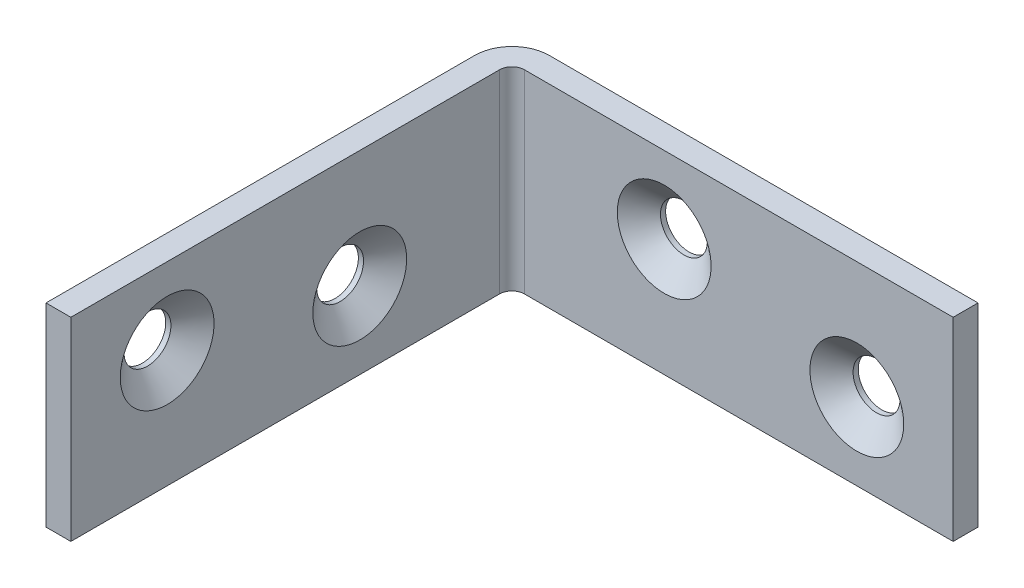
ISO-10303-21;
HEADER;
FILE_DESCRIPTION(('STEP AP214'),'2;1');
FILE_NAME('part.step','',(''),(''),'','','');
FILE_SCHEMA(('AUTOMOTIVE_DESIGN { 1 0 10303 214 1 1 1 1 }'));
ENDSEC;
DATA;
#1=APPLICATION_CONTEXT('core data for automotive mechanical design processes');
#2=APPLICATION_PROTOCOL_DEFINITION('international standard','automotive_design',2000,#1);
#3=PRODUCT_CONTEXT('',#1,'mechanical');
#4=PRODUCT('Part','Part','',(#3));
#5=PRODUCT_RELATED_PRODUCT_CATEGORY('part','',(#4));
#6=PRODUCT_DEFINITION_FORMATION('','',#4);
#7=PRODUCT_DEFINITION_CONTEXT('part definition',#1,'design');
#8=PRODUCT_DEFINITION('design','',#6,#7);
#9=PRODUCT_DEFINITION_SHAPE('','',#8);
#10=(LENGTH_UNIT() NAMED_UNIT(*) SI_UNIT(.MILLI.,.METRE.));
#11=(NAMED_UNIT(*) PLANE_ANGLE_UNIT() SI_UNIT($,.RADIAN.));
#12=(NAMED_UNIT(*) SI_UNIT($,.STERADIAN.) SOLID_ANGLE_UNIT());
#13=UNCERTAINTY_MEASURE_WITH_UNIT(LENGTH_MEASURE(1.E-05),#10,'distance_accuracy_value','');
#14=(GEOMETRIC_REPRESENTATION_CONTEXT(3) GLOBAL_UNCERTAINTY_ASSIGNED_CONTEXT((#13)) GLOBAL_UNIT_ASSIGNED_CONTEXT((#10,
#11,#12)) REPRESENTATION_CONTEXT('',''));
#15=CARTESIAN_POINT('',(0.,0.,0.));
#16=DIRECTION('',(0.,0.,1.));
#17=DIRECTION('',(1.,0.,0.));
#18=AXIS2_PLACEMENT_3D('',#15,#16,#17);
#19=CARTESIAN_POINT('',(3.048,7.9375,2.032));
#20=DIRECTION('',(0.,0.,-1.));
#21=DIRECTION('',(-1.,0.,0.));
#22=AXIS2_PLACEMENT_3D('',#19,#20,#21);
#23=PLANE('',#22);
#24=CARTESIAN_POINT('',(14.478,1.65099999999999,2.032));
#25=DIRECTION('',(0.,0.,-1.));
#26=DIRECTION('',(-1.,0.,0.));
#27=AXIS2_PLACEMENT_3D('',#24,#25,#26);
#28=CIRCLE('',#27,3.83539999999999);
#29=CARTESIAN_POINT('',(10.6426,1.65099999999999,2.032));
#30=VERTEX_POINT('',#29);
#31=EDGE_CURVE('E37',#30,#30,#28,.T.);
#32=ORIENTED_EDGE('',*,*,#31,.T.);
#33=EDGE_LOOP('',(#32));
#34=FACE_BOUND('',#33,.T.);
#35=CARTESIAN_POINT('',(30.226,-1.65100000000001,2.032));
#36=DIRECTION('',(0.,0.,-1.));
#37=DIRECTION('',(-1.,0.,0.));
#38=AXIS2_PLACEMENT_3D('',#35,#36,#37);
#39=CIRCLE('',#38,3.83540000000001);
#40=CARTESIAN_POINT('',(34.0614,-1.65100000000001,2.032));
#41=VERTEX_POINT('',#40);
#42=EDGE_CURVE('E164',#41,#41,#39,.T.);
#43=ORIENTED_EDGE('',*,*,#42,.T.);
#44=EDGE_LOOP('',(#43));
#45=FACE_BOUND('',#44,.T.);
#46=DIRECTION('',(1.,0.,0.));
#47=VECTOR('',#46,1.);
#48=CARTESIAN_POINT('',(3.048,-7.9375,2.032));
#49=LINE('',#48,#47);
#50=CARTESIAN_POINT('',(3.048,-7.9375,2.032));
#51=VERTEX_POINT('',#50);
#52=CARTESIAN_POINT('',(38.1,-7.9375,2.032));
#53=VERTEX_POINT('',#52);
#54=EDGE_CURVE('E133',#51,#53,#49,.T.);
#55=ORIENTED_EDGE('',*,*,#54,.T.);
#56=DIRECTION('',(0.,-1.,0.));
#57=VECTOR('',#56,1.);
#58=CARTESIAN_POINT('',(38.1,7.9375,2.032));
#59=LINE('',#58,#57);
#60=CARTESIAN_POINT('',(38.1,7.9375,2.032));
#61=VERTEX_POINT('',#60);
#62=EDGE_CURVE('E161',#61,#53,#59,.T.);
#63=ORIENTED_EDGE('',*,*,#62,.F.);
#64=DIRECTION('',(1.,0.,0.));
#65=VECTOR('',#64,1.);
#66=CARTESIAN_POINT('',(3.048,7.9375,2.032));
#67=LINE('',#66,#65);
#68=CARTESIAN_POINT('',(3.048,7.9375,2.032));
#69=VERTEX_POINT('',#68);
#70=EDGE_CURVE('E91',#69,#61,#67,.T.);
#71=ORIENTED_EDGE('',*,*,#70,.F.);
#72=DIRECTION('',(0.,-1.,0.));
#73=VECTOR('',#72,1.);
#74=CARTESIAN_POINT('',(3.048,7.9375,2.032));
#75=LINE('',#74,#73);
#76=EDGE_CURVE('E132',#69,#51,#75,.T.);
#77=ORIENTED_EDGE('',*,*,#76,.T.);
#78=EDGE_LOOP('',(#55,#63,#71,#77));
#79=FACE_BOUND('',#78,.T.);
#80=ADVANCED_FACE('F33',(#34,#45,#79),#23,.F.);
#81=CARTESIAN_POINT('',(38.1,7.9375,0.));
#82=DIRECTION('',(1.,0.,0.));
#83=DIRECTION('',(0.,0.,-1.));
#84=AXIS2_PLACEMENT_3D('',#81,#82,#83);
#85=PLANE('',#84);
#86=DIRECTION('',(0.,0.,1.));
#87=VECTOR('',#86,1.);
#88=CARTESIAN_POINT('',(38.1,-7.9375,0.));
#89=LINE('',#88,#87);
#90=CARTESIAN_POINT('',(38.1,-7.9375,0.));
#91=VERTEX_POINT('',#90);
#92=EDGE_CURVE('E136',#91,#53,#89,.T.);
#93=ORIENTED_EDGE('',*,*,#92,.F.);
#94=DIRECTION('',(0.,-1.,0.));
#95=VECTOR('',#94,1.);
#96=CARTESIAN_POINT('',(38.1,7.9375,0.));
#97=LINE('',#96,#95);
#98=CARTESIAN_POINT('',(38.1,7.9375,0.));
#99=VERTEX_POINT('',#98);
#100=EDGE_CURVE('E159',#99,#91,#97,.T.);
#101=ORIENTED_EDGE('',*,*,#100,.F.);
#102=DIRECTION('',(0.,0.,1.));
#103=VECTOR('',#102,1.);
#104=CARTESIAN_POINT('',(38.1,7.9375,0.));
#105=LINE('',#104,#103);
#106=EDGE_CURVE('E387',#99,#61,#105,.T.);
#107=ORIENTED_EDGE('',*,*,#106,.T.);
#108=ORIENTED_EDGE('',*,*,#62,.T.);
#109=EDGE_LOOP('',(#93,#101,#107,#108));
#110=FACE_BOUND('',#109,.T.);
#111=ADVANCED_FACE('F212',(#110),#85,.T.);
#112=CARTESIAN_POINT('',(3.048,7.9375,0.));
#113=DIRECTION('',(0.,0.,-1.));
#114=DIRECTION('',(-1.,0.,0.));
#115=AXIS2_PLACEMENT_3D('',#112,#113,#114);
#116=PLANE('',#115);
#117=CARTESIAN_POINT('',(14.478,1.65099999999999,0.));
#118=DIRECTION('',(0.,0.,1.));
#119=DIRECTION('',(1.,0.,0.));
#120=AXIS2_PLACEMENT_3D('',#117,#118,#119);
#121=CIRCLE('',#120,1.9177);
#122=CARTESIAN_POINT('',(16.3957,1.65099999999999,0.));
#123=VERTEX_POINT('',#122);
#124=EDGE_CURVE('E170',#123,#123,#121,.T.);
#125=ORIENTED_EDGE('',*,*,#124,.T.);
#126=EDGE_LOOP('',(#125));
#127=FACE_BOUND('',#126,.T.);
#128=CARTESIAN_POINT('',(30.226,-1.65100000000001,0.));
#129=DIRECTION('',(0.,0.,1.));
#130=DIRECTION('',(1.,0.,0.));
#131=AXIS2_PLACEMENT_3D('',#128,#129,#130);
#132=CIRCLE('',#131,1.9177);
#133=CARTESIAN_POINT('',(32.1437,-1.65100000000001,0.));
#134=VERTEX_POINT('',#133);
#135=EDGE_CURVE('E137',#134,#134,#132,.T.);
#136=ORIENTED_EDGE('',*,*,#135,.T.);
#137=EDGE_LOOP('',(#136));
#138=FACE_BOUND('',#137,.T.);
#139=DIRECTION('',(1.,0.,0.));
#140=VECTOR('',#139,1.);
#141=CARTESIAN_POINT('',(3.048,-7.9375,0.));
#142=LINE('',#141,#140);
#143=CARTESIAN_POINT('',(3.048,-7.9375,0.));
#144=VERTEX_POINT('',#143);
#145=EDGE_CURVE('E140',#144,#91,#142,.T.);
#146=ORIENTED_EDGE('',*,*,#145,.F.);
#147=DIRECTION('',(0.,-1.,0.));
#148=VECTOR('',#147,1.);
#149=CARTESIAN_POINT('',(3.048,7.9375,0.));
#150=LINE('',#149,#148);
#151=CARTESIAN_POINT('',(3.048,7.9375,0.));
#152=VERTEX_POINT('',#151);
#153=EDGE_CURVE('E157',#152,#144,#150,.T.);
#154=ORIENTED_EDGE('',*,*,#153,.F.);
#155=DIRECTION('',(1.,0.,0.));
#156=VECTOR('',#155,1.);
#157=CARTESIAN_POINT('',(3.048,7.9375,0.));
#158=LINE('',#157,#156);
#159=EDGE_CURVE('E386',#152,#99,#158,.T.);
#160=ORIENTED_EDGE('',*,*,#159,.T.);
#161=ORIENTED_EDGE('',*,*,#100,.T.);
#162=EDGE_LOOP('',(#146,#154,#160,#161));
#163=FACE_BOUND('',#162,.T.);
#164=ADVANCED_FACE('F192',(#127,#138,#163),#116,.T.);
#165=CARTESIAN_POINT('',(3.048,7.9375,3.048));
#166=DIRECTION('',(0.,-1.,0.));
#167=DIRECTION('',(0.,0.,-1.));
#168=AXIS2_PLACEMENT_3D('',#165,#166,#167);
#169=CYLINDRICAL_SURFACE('',#168,3.048);
#170=CARTESIAN_POINT('',(3.048,-7.9375,3.048));
#171=DIRECTION('',(0.,-1.,0.));
#172=DIRECTION('',(0.,0.,1.));
#173=AXIS2_PLACEMENT_3D('',#170,#171,#172);
#174=CIRCLE('',#173,3.048);
#175=CARTESIAN_POINT('',(0.,-7.9375,3.048));
#176=VERTEX_POINT('',#175);
#177=EDGE_CURVE('E143',#176,#144,#174,.T.);
#178=ORIENTED_EDGE('',*,*,#177,.F.);
#179=DIRECTION('',(0.,-1.,0.));
#180=VECTOR('',#179,1.);
#181=CARTESIAN_POINT('',(0.,7.9375,3.048));
#182=LINE('',#181,#180);
#183=CARTESIAN_POINT('',(0.,7.9375,3.048));
#184=VERTEX_POINT('',#183);
#185=EDGE_CURVE('E155',#184,#176,#182,.T.);
#186=ORIENTED_EDGE('',*,*,#185,.F.);
#187=CARTESIAN_POINT('',(3.048,7.9375,3.048));
#188=DIRECTION('',(0.,-1.,0.));
#189=DIRECTION('',(0.,0.,1.));
#190=AXIS2_PLACEMENT_3D('',#187,#188,#189);
#191=CIRCLE('',#190,3.048);
#192=EDGE_CURVE('E127',#184,#152,#191,.T.);
#193=ORIENTED_EDGE('',*,*,#192,.T.);
#194=ORIENTED_EDGE('',*,*,#153,.T.);
#195=EDGE_LOOP('',(#178,#186,#193,#194));
#196=FACE_BOUND('',#195,.T.);
#197=ADVANCED_FACE('F248',(#196),#169,.T.);
#198=CARTESIAN_POINT('',(0.,7.9375,38.1));
#199=DIRECTION('',(-1.,0.,0.));
#200=DIRECTION('',(0.,0.,1.));
#201=AXIS2_PLACEMENT_3D('',#198,#199,#200);
#202=PLANE('',#201);
#203=CARTESIAN_POINT('',(0.,-1.65099999999999,14.478));
#204=DIRECTION('',(1.,0.,0.));
#205=DIRECTION('',(0.,0.,1.));
#206=AXIS2_PLACEMENT_3D('',#203,#204,#205);
#207=CIRCLE('',#206,1.9177);
#208=CARTESIAN_POINT('',(0.,-1.65099999999999,16.3957));
#209=VERTEX_POINT('',#208);
#210=EDGE_CURVE('E178',#209,#209,#207,.T.);
#211=ORIENTED_EDGE('',*,*,#210,.T.);
#212=EDGE_LOOP('',(#211));
#213=FACE_BOUND('',#212,.T.);
#214=CARTESIAN_POINT('',(-1.0842021724855E-13,1.65100000000001,30.226));
#215=DIRECTION('',(1.,0.,0.));
#216=DIRECTION('',(0.,0.,1.));
#217=AXIS2_PLACEMENT_3D('',#214,#215,#216);
#218=CIRCLE('',#217,1.9177);
#219=CARTESIAN_POINT('',(-1.14168718923224E-13,1.65100000000001,32.1437));
#220=VERTEX_POINT('',#219);
#221=EDGE_CURVE('E181',#220,#220,#218,.T.);
#222=ORIENTED_EDGE('',*,*,#221,.T.);
#223=EDGE_LOOP('',(#222));
#224=FACE_BOUND('',#223,.T.);
#225=DIRECTION('',(0.,0.,-1.));
#226=VECTOR('',#225,1.);
#227=CARTESIAN_POINT('',(0.,-7.9375,38.1));
#228=LINE('',#227,#226);
#229=CARTESIAN_POINT('',(0.,-7.9375,38.1));
#230=VERTEX_POINT('',#229);
#231=EDGE_CURVE('E146',#230,#176,#228,.T.);
#232=ORIENTED_EDGE('',*,*,#231,.F.);
#233=DIRECTION('',(0.,-1.,0.));
#234=VECTOR('',#233,1.);
#235=CARTESIAN_POINT('',(0.,7.9375,38.1));
#236=LINE('',#235,#234);
#237=CARTESIAN_POINT('',(0.,7.9375,38.1));
#238=VERTEX_POINT('',#237);
#239=EDGE_CURVE('E115',#238,#230,#236,.T.);
#240=ORIENTED_EDGE('',*,*,#239,.F.);
#241=DIRECTION('',(0.,0.,-1.));
#242=VECTOR('',#241,1.);
#243=CARTESIAN_POINT('',(0.,7.9375,38.1));
#244=LINE('',#243,#242);
#245=EDGE_CURVE('E125',#238,#184,#244,.T.);
#246=ORIENTED_EDGE('',*,*,#245,.T.);
#247=ORIENTED_EDGE('',*,*,#185,.T.);
#248=EDGE_LOOP('',(#232,#240,#246,#247));
#249=FACE_BOUND('',#248,.T.);
#250=ADVANCED_FACE('F245',(#213,#224,#249),#202,.T.);
#251=CARTESIAN_POINT('',(2.032,7.9375,38.1));
#252=DIRECTION('',(0.,0.,1.));
#253=DIRECTION('',(1.,0.,0.));
#254=AXIS2_PLACEMENT_3D('',#251,#252,#253);
#255=PLANE('',#254);
#256=DIRECTION('',(-1.,0.,0.));
#257=VECTOR('',#256,1.);
#258=CARTESIAN_POINT('',(2.032,-7.9375,38.1));
#259=LINE('',#258,#257);
#260=CARTESIAN_POINT('',(2.032,-7.9375,38.1));
#261=VERTEX_POINT('',#260);
#262=EDGE_CURVE('E114',#261,#230,#259,.T.);
#263=ORIENTED_EDGE('',*,*,#262,.F.);
#264=DIRECTION('',(0.,-1.,0.));
#265=VECTOR('',#264,1.);
#266=CARTESIAN_POINT('',(2.032,7.9375,38.1));
#267=LINE('',#266,#265);
#268=CARTESIAN_POINT('',(2.032,7.9375,38.1));
#269=VERTEX_POINT('',#268);
#270=EDGE_CURVE('E108',#269,#261,#267,.T.);
#271=ORIENTED_EDGE('',*,*,#270,.F.);
#272=DIRECTION('',(-1.,0.,0.));
#273=VECTOR('',#272,1.);
#274=CARTESIAN_POINT('',(2.032,7.9375,38.1));
#275=LINE('',#274,#273);
#276=EDGE_CURVE('E112',#269,#238,#275,.T.);
#277=ORIENTED_EDGE('',*,*,#276,.T.);
#278=ORIENTED_EDGE('',*,*,#239,.T.);
#279=EDGE_LOOP('',(#263,#271,#277,#278));
#280=FACE_BOUND('',#279,.T.);
#281=ADVANCED_FACE('F110',(#280),#255,.T.);
#282=CARTESIAN_POINT('',(2.032,7.9375,38.1));
#283=DIRECTION('',(-1.,0.,0.));
#284=DIRECTION('',(0.,0.,1.));
#285=AXIS2_PLACEMENT_3D('',#282,#283,#284);
#286=PLANE('',#285);
#287=CARTESIAN_POINT('',(2.032,1.65100000000001,30.226));
#288=DIRECTION('',(-1.,0.,0.));
#289=DIRECTION('',(0.,0.,1.));
#290=AXIS2_PLACEMENT_3D('',#287,#288,#289);
#291=CIRCLE('',#290,3.83540000000012);
#292=CARTESIAN_POINT('',(2.032,1.65100000000001,34.0614000000001));
#293=VERTEX_POINT('',#292);
#294=EDGE_CURVE('E174',#293,#293,#291,.T.);
#295=ORIENTED_EDGE('',*,*,#294,.T.);
#296=EDGE_LOOP('',(#295));
#297=FACE_BOUND('',#296,.T.);
#298=CARTESIAN_POINT('',(2.032,-1.65099999999999,14.478));
#299=DIRECTION('',(-1.,0.,0.));
#300=DIRECTION('',(0.,0.,1.));
#301=AXIS2_PLACEMENT_3D('',#298,#299,#300);
#302=CIRCLE('',#301,3.83540000000006);
#303=CARTESIAN_POINT('',(2.032,-1.65099999999999,18.3134000000001));
#304=VERTEX_POINT('',#303);
#305=EDGE_CURVE('E175',#304,#304,#302,.T.);
#306=ORIENTED_EDGE('',*,*,#305,.T.);
#307=EDGE_LOOP('',(#306));
#308=FACE_BOUND('',#307,.T.);
#309=DIRECTION('',(0.,0.,-1.));
#310=VECTOR('',#309,1.);
#311=CARTESIAN_POINT('',(2.032,-7.9375,38.1));
#312=LINE('',#311,#310);
#313=CARTESIAN_POINT('',(2.032,-7.9375,3.048));
#314=VERTEX_POINT('',#313);
#315=EDGE_CURVE('E79',#261,#314,#312,.T.);
#316=ORIENTED_EDGE('',*,*,#315,.T.);
#317=DIRECTION('',(0.,-1.,0.));
#318=VECTOR('',#317,1.);
#319=CARTESIAN_POINT('',(2.032,7.9375,3.048));
#320=LINE('',#319,#318);
#321=CARTESIAN_POINT('',(2.032,7.9375,3.048));
#322=VERTEX_POINT('',#321);
#323=EDGE_CURVE('E116',#322,#314,#320,.T.);
#324=ORIENTED_EDGE('',*,*,#323,.F.);
#325=DIRECTION('',(0.,0.,-1.));
#326=VECTOR('',#325,1.);
#327=CARTESIAN_POINT('',(2.032,7.9375,38.1));
#328=LINE('',#327,#326);
#329=EDGE_CURVE('E118',#269,#322,#328,.T.);
#330=ORIENTED_EDGE('',*,*,#329,.F.);
#331=ORIENTED_EDGE('',*,*,#270,.T.);
#332=EDGE_LOOP('',(#316,#324,#330,#331));
#333=FACE_BOUND('',#332,.T.);
#334=ADVANCED_FACE('F119',(#297,#308,#333),#286,.F.);
#335=CARTESIAN_POINT('',(3.048,7.9375,3.048));
#336=DIRECTION('',(0.,-1.,0.));
#337=DIRECTION('',(0.,0.,-1.));
#338=AXIS2_PLACEMENT_3D('',#335,#336,#337);
#339=CYLINDRICAL_SURFACE('',#338,1.016);
#340=CARTESIAN_POINT('',(3.048,-7.9375,3.048));
#341=DIRECTION('',(0.,1.,0.));
#342=DIRECTION('',(1.,0.,0.));
#343=AXIS2_PLACEMENT_3D('',#340,#341,#342);
#344=CIRCLE('',#343,1.016);
#345=EDGE_CURVE('E85',#314,#51,#344,.F.);
#346=ORIENTED_EDGE('',*,*,#345,.T.);
#347=ORIENTED_EDGE('',*,*,#76,.F.);
#348=CARTESIAN_POINT('',(3.048,7.9375,3.048));
#349=DIRECTION('',(0.,1.,0.));
#350=DIRECTION('',(1.,0.,0.));
#351=AXIS2_PLACEMENT_3D('',#348,#349,#350);
#352=CIRCLE('',#351,1.016);
#353=EDGE_CURVE('E51',#322,#69,#352,.F.);
#354=ORIENTED_EDGE('',*,*,#353,.F.);
#355=ORIENTED_EDGE('',*,*,#323,.T.);
#356=EDGE_LOOP('',(#346,#347,#354,#355));
#357=FACE_BOUND('',#356,.T.);
#358=ADVANCED_FACE('F258',(#357),#339,.F.);
#359=CARTESIAN_POINT('',(3.048,7.9375,3.048));
#360=DIRECTION('',(0.,-1.,0.));
#361=DIRECTION('',(-1.,0.,0.));
#362=AXIS2_PLACEMENT_3D('',#359,#360,#361);
#363=PLANE('',#362);
#364=ORIENTED_EDGE('',*,*,#70,.T.);
#365=ORIENTED_EDGE('',*,*,#106,.F.);
#366=ORIENTED_EDGE('',*,*,#159,.F.);
#367=ORIENTED_EDGE('',*,*,#192,.F.);
#368=ORIENTED_EDGE('',*,*,#245,.F.);
#369=ORIENTED_EDGE('',*,*,#276,.F.);
#370=ORIENTED_EDGE('',*,*,#329,.T.);
#371=ORIENTED_EDGE('',*,*,#353,.T.);
#372=EDGE_LOOP('',(#364,#365,#366,#367,#368,#369,#370,#371));
#373=FACE_BOUND('',#372,.T.);
#374=ADVANCED_FACE('F122',(#373),#363,.F.);
#375=CARTESIAN_POINT('',(3.048,-7.9375,3.048));
#376=DIRECTION('',(0.,-1.,0.));
#377=DIRECTION('',(-1.,0.,0.));
#378=AXIS2_PLACEMENT_3D('',#375,#376,#377);
#379=PLANE('',#378);
#380=ORIENTED_EDGE('',*,*,#54,.F.);
#381=ORIENTED_EDGE('',*,*,#345,.F.);
#382=ORIENTED_EDGE('',*,*,#315,.F.);
#383=ORIENTED_EDGE('',*,*,#262,.T.);
#384=ORIENTED_EDGE('',*,*,#231,.T.);
#385=ORIENTED_EDGE('',*,*,#177,.T.);
#386=ORIENTED_EDGE('',*,*,#145,.T.);
#387=ORIENTED_EDGE('',*,*,#92,.T.);
#388=EDGE_LOOP('',(#380,#381,#382,#383,#384,#385,#386,#387));
#389=FACE_BOUND('',#388,.T.);
#390=ADVANCED_FACE('F207',(#389),#379,.T.);
#391=CARTESIAN_POINT('',(30.226,-1.65100000000001,0.));
#392=DIRECTION('',(0.,0.,1.));
#393=DIRECTION('',(1.,0.,0.));
#394=AXIS2_PLACEMENT_3D('',#391,#392,#393);
#395=CYLINDRICAL_SURFACE('',#394,1.9177);
#396=CARTESIAN_POINT('',(30.226,-1.65100000000001,0.422858637291328));
#397=DIRECTION('',(0.,0.,-1.));
#398=DIRECTION('',(-1.,0.,0.));
#399=AXIS2_PLACEMENT_3D('',#396,#397,#398);
#400=CIRCLE('',#399,1.9177);
#401=CARTESIAN_POINT('',(32.1437,-1.65100000000001,0.422858637291328));
#402=VERTEX_POINT('',#401);
#403=EDGE_CURVE('E12',#402,#402,#400,.F.);
#404=ORIENTED_EDGE('',*,*,#403,.T.);
#405=EDGE_LOOP('',(#404));
#406=FACE_BOUND('',#405,.T.);
#407=ORIENTED_EDGE('',*,*,#135,.F.);
#408=EDGE_LOOP('',(#407));
#409=FACE_BOUND('',#408,.T.);
#410=ADVANCED_FACE('F198',(#406,#409),#395,.F.);
#411=CARTESIAN_POINT('',(14.478,1.65099999999999,0.));
#412=DIRECTION('',(0.,0.,1.));
#413=DIRECTION('',(1.,0.,0.));
#414=AXIS2_PLACEMENT_3D('',#411,#412,#413);
#415=CYLINDRICAL_SURFACE('',#414,1.9177);
#416=CARTESIAN_POINT('',(14.478,1.65099999999999,0.422858637291343));
#417=DIRECTION('',(0.,0.,-1.));
#418=DIRECTION('',(-1.,0.,0.));
#419=AXIS2_PLACEMENT_3D('',#416,#417,#418);
#420=CIRCLE('',#419,1.9177);
#421=CARTESIAN_POINT('',(12.5603,1.65099999999999,0.422858637291343));
#422=VERTEX_POINT('',#421);
#423=EDGE_CURVE('E167',#422,#422,#420,.F.);
#424=ORIENTED_EDGE('',*,*,#423,.T.);
#425=EDGE_LOOP('',(#424));
#426=FACE_BOUND('',#425,.T.);
#427=ORIENTED_EDGE('',*,*,#124,.F.);
#428=EDGE_LOOP('',(#427));
#429=FACE_BOUND('',#428,.T.);
#430=ADVANCED_FACE('F195',(#426,#429),#415,.F.);
#431=CARTESIAN_POINT('',(-1.0842021724855E-13,1.65100000000001,30.226));
#432=DIRECTION('',(1.,0.,0.));
#433=DIRECTION('',(0.,0.,-1.));
#434=AXIS2_PLACEMENT_3D('',#431,#432,#433);
#435=CYLINDRICAL_SURFACE('',#434,1.9177);
#436=CARTESIAN_POINT('',(0.422858637291262,1.65100000000001,30.226));
#437=DIRECTION('',(-1.,0.,0.));
#438=DIRECTION('',(0.,0.,1.));
#439=AXIS2_PLACEMENT_3D('',#436,#437,#438);
#440=CIRCLE('',#439,1.9177);
#441=CARTESIAN_POINT('',(0.422858637291253,1.65100000000001,32.1437));
#442=VERTEX_POINT('',#441);
#443=EDGE_CURVE('E162',#442,#442,#440,.F.);
#444=ORIENTED_EDGE('',*,*,#443,.T.);
#445=EDGE_LOOP('',(#444));
#446=FACE_BOUND('',#445,.T.);
#447=ORIENTED_EDGE('',*,*,#221,.F.);
#448=EDGE_LOOP('',(#447));
#449=FACE_BOUND('',#448,.T.);
#450=ADVANCED_FACE('F197',(#446,#449),#435,.F.);
#451=CARTESIAN_POINT('',(0.,-1.65099999999999,14.478));
#452=DIRECTION('',(1.,0.,0.));
#453=DIRECTION('',(0.,0.,-1.));
#454=AXIS2_PLACEMENT_3D('',#451,#452,#453);
#455=CYLINDRICAL_SURFACE('',#454,1.9177);
#456=CARTESIAN_POINT('',(0.422858637291303,-1.65099999999999,14.478));
#457=DIRECTION('',(-1.,0.,0.));
#458=DIRECTION('',(0.,0.,1.));
#459=AXIS2_PLACEMENT_3D('',#456,#457,#458);
#460=CIRCLE('',#459,1.9177);
#461=CARTESIAN_POINT('',(0.422858637291297,-1.65099999999999,16.3957));
#462=VERTEX_POINT('',#461);
#463=EDGE_CURVE('E171',#462,#462,#460,.F.);
#464=ORIENTED_EDGE('',*,*,#463,.T.);
#465=EDGE_LOOP('',(#464));
#466=FACE_BOUND('',#465,.T.);
#467=ORIENTED_EDGE('',*,*,#210,.F.);
#468=EDGE_LOOP('',(#467));
#469=FACE_BOUND('',#468,.T.);
#470=ADVANCED_FACE('F204',(#466,#469),#455,.F.);
#471=CARTESIAN_POINT('',(0.42285863729126,1.65100000000001,30.226));
#472=DIRECTION('',(1.,0.,0.));
#473=DIRECTION('',(0.,0.,-1.));
#474=AXIS2_PLACEMENT_3D('',#471,#472,#473);
#475=CONICAL_SURFACE('',#474,1.9177,0.87266462599717);
#476=ORIENTED_EDGE('',*,*,#294,.F.);
#477=EDGE_LOOP('',(#476));
#478=FACE_BOUND('',#477,.T.);
#479=ORIENTED_EDGE('',*,*,#443,.F.);
#480=EDGE_LOOP('',(#479));
#481=FACE_BOUND('',#480,.T.);
#482=ADVANCED_FACE('F231',(#478,#481),#475,.F.);
#483=CARTESIAN_POINT('',(0.422858637291303,-1.65099999999999,14.478));
#484=DIRECTION('',(1.,0.,0.));
#485=DIRECTION('',(0.,0.,-1.));
#486=AXIS2_PLACEMENT_3D('',#483,#484,#485);
#487=CONICAL_SURFACE('',#486,1.9177,0.872664625997169);
#488=ORIENTED_EDGE('',*,*,#305,.F.);
#489=EDGE_LOOP('',(#488));
#490=FACE_BOUND('',#489,.T.);
#491=ORIENTED_EDGE('',*,*,#463,.F.);
#492=EDGE_LOOP('',(#491));
#493=FACE_BOUND('',#492,.T.);
#494=ADVANCED_FACE('F228',(#490,#493),#487,.F.);
#495=CARTESIAN_POINT('',(14.478,1.65099999999999,0.422858637291343));
#496=DIRECTION('',(0.,0.,1.));
#497=DIRECTION('',(1.,0.,0.));
#498=AXIS2_PLACEMENT_3D('',#495,#496,#497);
#499=CONICAL_SURFACE('',#498,1.9177,0.872664625997166);
#500=ORIENTED_EDGE('',*,*,#31,.F.);
#501=EDGE_LOOP('',(#500));
#502=FACE_BOUND('',#501,.T.);
#503=ORIENTED_EDGE('',*,*,#423,.F.);
#504=EDGE_LOOP('',(#503));
#505=FACE_BOUND('',#504,.T.);
#506=ADVANCED_FACE('F35',(#502,#505),#499,.F.);
#507=CARTESIAN_POINT('',(30.226,-1.65100000000001,0.422858637291328));
#508=DIRECTION('',(0.,0.,1.));
#509=DIRECTION('',(1.,0.,0.));
#510=AXIS2_PLACEMENT_3D('',#507,#508,#509);
#511=CONICAL_SURFACE('',#510,1.9177,0.872664625997165);
#512=CARTESIAN_POINT('',(34.0614,-1.65100000000001,2.032));
#513=CARTESIAN_POINT('',(34.0414239583334,-1.65100000000001,2.01523811080512));
#514=CARTESIAN_POINT('',(34.0214479166667,-1.65100000000001,1.99847622161024));
#515=CARTESIAN_POINT('',(33.9814958333333,-1.65100000000001,1.96495244322047));
#516=CARTESIAN_POINT('',(33.9615197916667,-1.65100000000001,1.94819055402559));
#517=CARTESIAN_POINT('',(33.9215677083333,-1.65100000000001,1.91466677563583));
#518=CARTESIAN_POINT('',(33.9015916666667,-1.65100000000001,1.89790488644094));
#519=CARTESIAN_POINT('',(33.8616395833333,-1.65100000000001,1.86438110805118));
#520=CARTESIAN_POINT('',(33.8416635416667,-1.65100000000001,1.8476192188563));
#521=CARTESIAN_POINT('',(33.8017114583334,-1.65100000000001,1.81409544046653));
#522=CARTESIAN_POINT('',(33.7817354166667,-1.65100000000001,1.79733355127165));
#523=CARTESIAN_POINT('',(33.7417833333333,-1.65100000000001,1.76380977288189));
#524=CARTESIAN_POINT('',(33.7218072916667,-1.65100000000001,1.74704788368701));
#525=CARTESIAN_POINT('',(33.6818552083333,-1.65100000000001,1.71352410529724));
#526=CARTESIAN_POINT('',(33.6618791666667,-1.65100000000001,1.69676221610236));
#527=CARTESIAN_POINT('',(33.6219270833333,-1.65100000000001,1.6632384377126));
#528=CARTESIAN_POINT('',(33.6019510416667,-1.65100000000001,1.64647654851771));
#529=CARTESIAN_POINT('',(33.5619989583333,-1.65100000000001,1.61295277012795));
#530=CARTESIAN_POINT('',(33.5420229166667,-1.65100000000001,1.59619088093307));
#531=CARTESIAN_POINT('',(33.5020708333333,-1.65100000000001,1.5626671025433));
#532=CARTESIAN_POINT('',(33.4820947916667,-1.65100000000001,1.54590521334842));
#533=CARTESIAN_POINT('',(33.4421427083333,-1.65100000000001,1.51238143495866));
#534=CARTESIAN_POINT('',(33.4221666666667,-1.65100000000001,1.49561954576378));
#535=CARTESIAN_POINT('',(33.3822145833334,-1.65100000000001,1.46209576737401));
#536=CARTESIAN_POINT('',(33.3622385416667,-1.65100000000001,1.44533387817913));
#537=CARTESIAN_POINT('',(33.3222864583333,-1.65100000000001,1.41181009978937));
#538=CARTESIAN_POINT('',(33.3023104166667,-1.65100000000001,1.39504821059448));
#539=CARTESIAN_POINT('',(33.2623583333333,-1.65100000000001,1.36152443220472));
#540=CARTESIAN_POINT('',(33.2423822916667,-1.65100000000001,1.34476254300984));
#541=CARTESIAN_POINT('',(33.2024302083333,-1.65100000000001,1.31123876462007));
#542=CARTESIAN_POINT('',(33.1824541666667,-1.65100000000001,1.29447687542519));
#543=CARTESIAN_POINT('',(33.1425020833333,-1.65100000000001,1.26095309703543));
#544=CARTESIAN_POINT('',(33.1225260416667,-1.65100000000001,1.24419120784055));
#545=CARTESIAN_POINT('',(33.0825739583333,-1.65100000000001,1.21066742945078));
#546=CARTESIAN_POINT('',(33.0625979166667,-1.65100000000001,1.1939055402559));
#547=CARTESIAN_POINT('',(33.0226458333333,-1.65100000000001,1.16038176186614));
#548=CARTESIAN_POINT('',(33.0026697916667,-1.65100000000001,1.14361987267125));
#549=CARTESIAN_POINT('',(32.9627177083333,-1.65100000000001,1.11009609428149));
#550=CARTESIAN_POINT('',(32.9427416666667,-1.65100000000001,1.09333420508661));
#551=CARTESIAN_POINT('',(32.9027895833334,-1.65100000000001,1.05981042669684));
#552=CARTESIAN_POINT('',(32.8828135416667,-1.65100000000001,1.04304853750196));
#553=CARTESIAN_POINT('',(32.8428614583333,-1.65100000000001,1.0095247591122));
#554=CARTESIAN_POINT('',(32.8228854166667,-1.65100000000001,0.992762869917315));
#555=CARTESIAN_POINT('',(32.7829333333333,-1.65100000000001,0.959239091527551));
#556=CARTESIAN_POINT('',(32.7629572916667,-1.65100000000001,0.94247720233267));
#557=CARTESIAN_POINT('',(32.7230052083333,-1.65100000000001,0.908953423942906));
#558=CARTESIAN_POINT('',(32.7030291666667,-1.65100000000001,0.892191534748023));
#559=CARTESIAN_POINT('',(32.6630770833333,-1.65100000000001,0.858667756358259));
#560=CARTESIAN_POINT('',(32.6431010416667,-1.65100000000001,0.841905867163378));
#561=CARTESIAN_POINT('',(32.6031489583333,-1.65100000000001,0.808382088773615));
#562=CARTESIAN_POINT('',(32.5831729166667,-1.65100000000001,0.791620199578731));
#563=CARTESIAN_POINT('',(32.5432208333333,-1.65100000000001,0.758096421188967));
#564=CARTESIAN_POINT('',(32.5232447916667,-1.65100000000001,0.741334531994086));
#565=CARTESIAN_POINT('',(32.4832927083333,-1.65100000000001,0.707810753604323));
#566=CARTESIAN_POINT('',(32.4633166666667,-1.65100000000001,0.69104886440944));
#567=CARTESIAN_POINT('',(32.4233645833333,-1.65100000000001,0.657525086019676));
#568=CARTESIAN_POINT('',(32.4033885416667,-1.65100000000001,0.640763196824793));
#569=CARTESIAN_POINT('',(32.3634364583333,-1.65100000000001,0.60723941843503));
#570=CARTESIAN_POINT('',(32.3434604166667,-1.65100000000001,0.590477529240148));
#571=CARTESIAN_POINT('',(32.3035083333333,-1.65100000000001,0.556953750850384));
#572=CARTESIAN_POINT('',(32.2835322916667,-1.65100000000001,0.540191861655501));
#573=CARTESIAN_POINT('',(32.2435802083333,-1.65100000000001,0.506668083265737));
#574=CARTESIAN_POINT('',(32.2236041666667,-1.65100000000001,0.489906194070856));
#575=CARTESIAN_POINT('',(32.1836520833333,-1.65100000000001,0.456382415681093));
#576=CARTESIAN_POINT('',(32.1636760416667,-1.65100000000001,0.439620526486211));
#577=CARTESIAN_POINT('',(32.1437,-1.65100000000001,0.422858637291328));
#578=B_SPLINE_CURVE_WITH_KNOTS('',3,(#512,#513,#514,#515,#516,#517,#518,#519,#520,#521,#522,
#523,#524,#525,#526,#527,#528,#529,#530,#531,#532,#533,#534,#535,#536,#537,#538,#539,#540,#541,
#542,#543,#544,#545,#546,#547,#548,#549,#550,#551,#552,#553,#554,#555,#556,#557,#558,#559,#560,
#561,#562,#563,#564,#565,#566,#567,#568,#569,#570,#571,#572,#573,#574,#575,#576,#577),
.UNSPECIFIED.,.F.,.F.,(4,2,2,2,2,2,2,2,2,2,2,2,2,2,2,2,2,2,2,2,2,2,2,2,2,2,2,2,2,2,2,2,4),(0.,
0.078230611211019,0.156461222422033,0.234691833633052,0.312922444844066,0.391153056055085,
0.469383667266099,0.547614278477113,0.625844889688132,0.704075500899146,0.782306112110165,
0.860536723321179,0.938767334532198,1.01699794574321,1.09522855695423,1.17345916816525,
1.25168977937626,1.32992039058728,1.40815100179829,1.48638161300931,1.56461222422033,
1.64284283543134,1.72107344664236,1.79930405785337,1.87753466906439,1.95576528027541,
2.03399589148642,2.11222650269744,2.19045711390845,2.26868772511947,2.34691833633049,
2.42514894754151,2.50337955875252),.UNSPECIFIED.);
#579=EDGE_CURVE('BSEAM224',#41,#402,#578,.T.);
#580=ORIENTED_EDGE('',*,*,#42,.F.);
#581=ORIENTED_EDGE('',*,*,#403,.F.);
#582=ORIENTED_EDGE('',*,*,#579,.T.);
#583=ORIENTED_EDGE('',*,*,#579,.F.);
#584=EDGE_LOOP('',(#580,#582,#581,#583));
#585=FACE_BOUND('',#584,.T.);
#586=ADVANCED_FACE('F224',(#585),#511,.F.);
#587=CLOSED_SHELL('',(#80,#111,#164,#197,#250,#281,#334,#358,#374,#390,#410,#430,#450,#470,#482,
#494,#506,#586));
#588=MANIFOLD_SOLID_BREP('B2',#587);
#589=ADVANCED_BREP_SHAPE_REPRESENTATION('',(#18,#588),#14);
#590=SHAPE_DEFINITION_REPRESENTATION(#9,#589);
ENDSEC;
END-ISO-10303-21;
